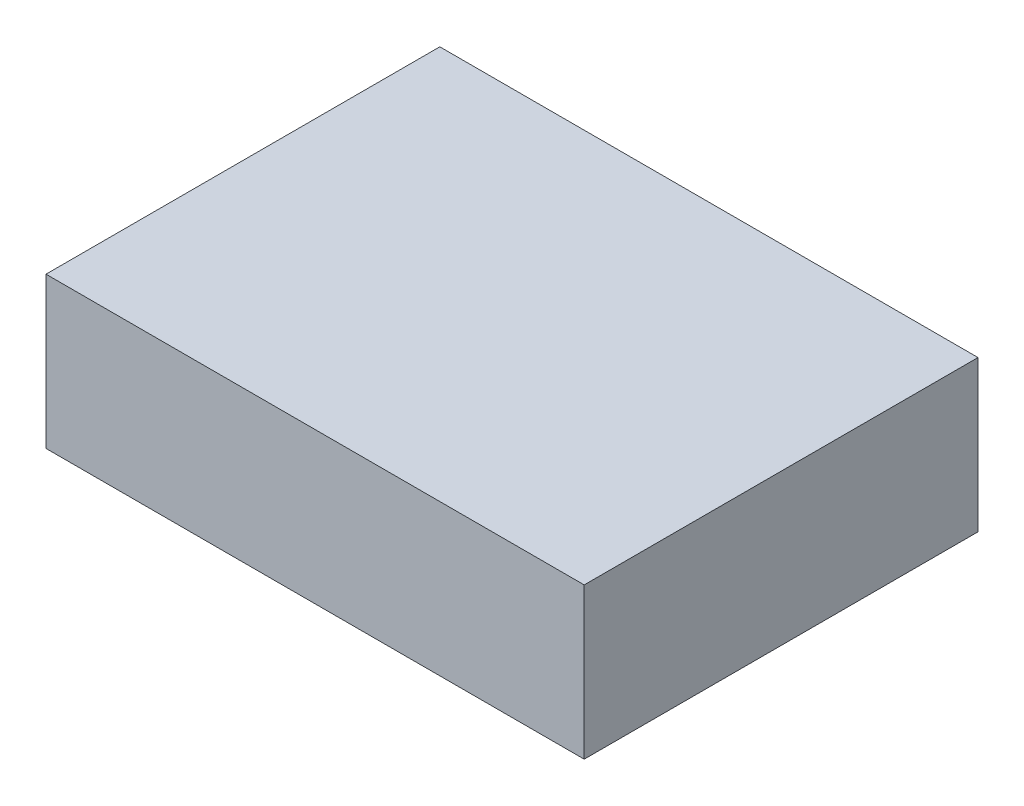
ISO-10303-21;
HEADER;
FILE_DESCRIPTION(('STEP AP214'),'2;1');
FILE_NAME('part.step','',(''),(''),'','','');
FILE_SCHEMA(('AUTOMOTIVE_DESIGN { 1 0 10303 214 1 1 1 1 }'));
ENDSEC;
DATA;
#1=APPLICATION_CONTEXT('core data for automotive mechanical design processes');
#2=APPLICATION_PROTOCOL_DEFINITION('international standard','automotive_design',2000,#1);
#3=PRODUCT_CONTEXT('',#1,'mechanical');
#4=PRODUCT('Part','Part','',(#3));
#5=PRODUCT_RELATED_PRODUCT_CATEGORY('part','',(#4));
#6=PRODUCT_DEFINITION_FORMATION('','',#4);
#7=PRODUCT_DEFINITION_CONTEXT('part definition',#1,'design');
#8=PRODUCT_DEFINITION('design','',#6,#7);
#9=PRODUCT_DEFINITION_SHAPE('','',#8);
#10=(LENGTH_UNIT() NAMED_UNIT(*) SI_UNIT(.MILLI.,.METRE.));
#11=(NAMED_UNIT(*) PLANE_ANGLE_UNIT() SI_UNIT($,.RADIAN.));
#12=(NAMED_UNIT(*) SI_UNIT($,.STERADIAN.) SOLID_ANGLE_UNIT());
#13=UNCERTAINTY_MEASURE_WITH_UNIT(LENGTH_MEASURE(1.E-05),#10,'distance_accuracy_value','');
#14=(GEOMETRIC_REPRESENTATION_CONTEXT(3) GLOBAL_UNCERTAINTY_ASSIGNED_CONTEXT((#13)) GLOBAL_UNIT_ASSIGNED_CONTEXT((#10,
#11,#12)) REPRESENTATION_CONTEXT('',''));
#15=CARTESIAN_POINT('',(0.,0.,0.));
#16=DIRECTION('',(0.,0.,1.));
#17=DIRECTION('',(1.,0.,0.));
#18=AXIS2_PLACEMENT_3D('',#15,#16,#17);
#19=CARTESIAN_POINT('',(2.05,0.64,-2.29));
#20=DIRECTION('',(0.,1.,0.));
#21=DIRECTION('',(0.,0.,1.));
#22=AXIS2_PLACEMENT_3D('',#19,#20,#21);
#23=CYLINDRICAL_SURFACE('',#22,0.15);
#24=CARTESIAN_POINT('',(2.05,0.64,-2.29));
#25=DIRECTION('',(0.,1.,0.));
#26=DIRECTION('',(0.,0.,1.));
#27=AXIS2_PLACEMENT_3D('',#24,#25,#26);
#28=CIRCLE('',#27,0.15);
#29=CARTESIAN_POINT('',(2.05,0.64,-2.14));
#30=VERTEX_POINT('',#29);
#31=EDGE_CURVE('E11',#30,#30,#28,.T.);
#32=ORIENTED_EDGE('',*,*,#31,.T.);
#33=EDGE_LOOP('',(#32));
#34=FACE_BOUND('',#33,.T.);
#35=CARTESIAN_POINT('',(2.05,0.74,-2.29));
#36=DIRECTION('',(0.,1.,0.));
#37=DIRECTION('',(0.,0.,1.));
#38=AXIS2_PLACEMENT_3D('',#35,#36,#37);
#39=CIRCLE('',#38,0.15);
#40=CARTESIAN_POINT('',(2.05,0.74,-2.14));
#41=VERTEX_POINT('',#40);
#42=EDGE_CURVE('E44',#41,#41,#39,.T.);
#43=ORIENTED_EDGE('',*,*,#42,.F.);
#44=EDGE_LOOP('',(#43));
#45=FACE_BOUND('',#44,.T.);
#46=ADVANCED_FACE('F41',(#34,#45),#23,.T.);
#47=CARTESIAN_POINT('',(2.05,0.64,-2.29));
#48=DIRECTION('',(0.,1.,0.));
#49=DIRECTION('',(0.,0.,1.));
#50=AXIS2_PLACEMENT_3D('',#47,#48,#49);
#51=PLANE('',#50);
#52=ORIENTED_EDGE('',*,*,#31,.F.);
#53=EDGE_LOOP('',(#52));
#54=FACE_BOUND('',#53,.T.);
#55=ADVANCED_FACE('F56',(#54),#51,.F.);
#56=CARTESIAN_POINT('',(2.05,0.74,-2.29));
#57=DIRECTION('',(0.,1.,0.));
#58=DIRECTION('',(0.,0.,1.));
#59=AXIS2_PLACEMENT_3D('',#56,#57,#58);
#60=PLANE('',#59);
#61=ORIENTED_EDGE('',*,*,#42,.T.);
#62=EDGE_LOOP('',(#61));
#63=FACE_BOUND('',#62,.T.);
#64=ADVANCED_FACE('F53',(#63),#60,.T.);
#65=CLOSED_SHELL('',(#46,#55,#64));
#66=MANIFOLD_SOLID_BREP('B2',#65);
#67=CARTESIAN_POINT('',(0.,1.15,0.));
#68=DIRECTION('',(1.,0.,0.));
#69=DIRECTION('',(0.,0.,-1.));
#70=AXIS2_PLACEMENT_3D('',#67,#68,#69);
#71=PLANE('',#70);
#72=DIRECTION('',(0.,0.,1.));
#73=VECTOR('',#72,1.);
#74=CARTESIAN_POINT('',(0.,0.,0.));
#75=LINE('',#74,#73);
#76=CARTESIAN_POINT('',(0.,0.,-3.));
#77=VERTEX_POINT('',#76);
#78=CARTESIAN_POINT('',(0.,0.,0.));
#79=VERTEX_POINT('',#78);
#80=EDGE_CURVE('E144',#77,#79,#75,.T.);
#81=ORIENTED_EDGE('',*,*,#80,.T.);
#82=DIRECTION('',(0.,-1.,0.));
#83=VECTOR('',#82,1.);
#84=CARTESIAN_POINT('',(0.,1.15,0.));
#85=LINE('',#84,#83);
#86=CARTESIAN_POINT('',(0.,1.15,0.));
#87=VERTEX_POINT('',#86);
#88=EDGE_CURVE('E39',#87,#79,#85,.T.);
#89=ORIENTED_EDGE('',*,*,#88,.F.);
#90=DIRECTION('',(0.,0.,1.));
#91=VECTOR('',#90,1.);
#92=CARTESIAN_POINT('',(0.,1.15,0.));
#93=LINE('',#92,#91);
#94=CARTESIAN_POINT('',(0.,1.15,-3.));
#95=VERTEX_POINT('',#94);
#96=EDGE_CURVE('E132',#95,#87,#93,.T.);
#97=ORIENTED_EDGE('',*,*,#96,.F.);
#98=DIRECTION('',(0.,-1.,0.));
#99=VECTOR('',#98,1.);
#100=CARTESIAN_POINT('',(0.,1.15,-3.));
#101=LINE('',#100,#99);
#102=EDGE_CURVE('E140',#95,#77,#101,.T.);
#103=ORIENTED_EDGE('',*,*,#102,.T.);
#104=EDGE_LOOP('',(#81,#89,#97,#103));
#105=FACE_BOUND('',#104,.T.);
#106=ADVANCED_FACE('F81',(#105),#71,.F.);
#107=CARTESIAN_POINT('',(0.,1.15,0.));
#108=DIRECTION('',(0.,0.,-1.));
#109=DIRECTION('',(-1.,0.,0.));
#110=AXIS2_PLACEMENT_3D('',#107,#108,#109);
#111=PLANE('',#110);
#112=DIRECTION('',(1.,0.,0.));
#113=VECTOR('',#112,1.);
#114=CARTESIAN_POINT('',(0.,0.,0.));
#115=LINE('',#114,#113);
#116=CARTESIAN_POINT('',(4.1,0.,0.));
#117=VERTEX_POINT('',#116);
#118=EDGE_CURVE('E136',#79,#117,#115,.T.);
#119=ORIENTED_EDGE('',*,*,#118,.T.);
#120=DIRECTION('',(0.,-1.,0.));
#121=VECTOR('',#120,1.);
#122=CARTESIAN_POINT('',(4.1,1.15,0.));
#123=LINE('',#122,#121);
#124=CARTESIAN_POINT('',(4.1,1.15,0.));
#125=VERTEX_POINT('',#124);
#126=EDGE_CURVE('E89',#125,#117,#123,.T.);
#127=ORIENTED_EDGE('',*,*,#126,.F.);
#128=DIRECTION('',(1.,0.,0.));
#129=VECTOR('',#128,1.);
#130=CARTESIAN_POINT('',(0.,1.15,0.));
#131=LINE('',#130,#129);
#132=EDGE_CURVE('E127',#87,#125,#131,.T.);
#133=ORIENTED_EDGE('',*,*,#132,.F.);
#134=ORIENTED_EDGE('',*,*,#88,.T.);
#135=EDGE_LOOP('',(#119,#127,#133,#134));
#136=FACE_BOUND('',#135,.T.);
#137=ADVANCED_FACE('F135',(#136),#111,.F.);
#138=CARTESIAN_POINT('',(4.1,1.15,0.));
#139=DIRECTION('',(-1.,0.,0.));
#140=DIRECTION('',(0.,0.,1.));
#141=AXIS2_PLACEMENT_3D('',#138,#139,#140);
#142=PLANE('',#141);
#143=DIRECTION('',(0.,0.,-1.));
#144=VECTOR('',#143,1.);
#145=CARTESIAN_POINT('',(4.1,0.,0.));
#146=LINE('',#145,#144);
#147=CARTESIAN_POINT('',(4.1,0.,-3.));
#148=VERTEX_POINT('',#147);
#149=EDGE_CURVE('E114',#117,#148,#146,.T.);
#150=ORIENTED_EDGE('',*,*,#149,.T.);
#151=DIRECTION('',(0.,-1.,0.));
#152=VECTOR('',#151,1.);
#153=CARTESIAN_POINT('',(4.1,1.15,-3.));
#154=LINE('',#153,#152);
#155=CARTESIAN_POINT('',(4.1,1.15,-3.));
#156=VERTEX_POINT('',#155);
#157=EDGE_CURVE('E137',#156,#148,#154,.T.);
#158=ORIENTED_EDGE('',*,*,#157,.F.);
#159=DIRECTION('',(0.,0.,-1.));
#160=VECTOR('',#159,1.);
#161=CARTESIAN_POINT('',(4.1,1.15,0.));
#162=LINE('',#161,#160);
#163=EDGE_CURVE('E130',#125,#156,#162,.T.);
#164=ORIENTED_EDGE('',*,*,#163,.F.);
#165=ORIENTED_EDGE('',*,*,#126,.T.);
#166=EDGE_LOOP('',(#150,#158,#164,#165));
#167=FACE_BOUND('',#166,.T.);
#168=ADVANCED_FACE('F138',(#167),#142,.F.);
#169=CARTESIAN_POINT('',(0.,1.15,-3.));
#170=DIRECTION('',(0.,0.,1.));
#171=DIRECTION('',(1.,0.,0.));
#172=AXIS2_PLACEMENT_3D('',#169,#170,#171);
#173=PLANE('',#172);
#174=DIRECTION('',(-1.,0.,0.));
#175=VECTOR('',#174,1.);
#176=CARTESIAN_POINT('',(0.,0.,-3.));
#177=LINE('',#176,#175);
#178=EDGE_CURVE('E120',#148,#77,#177,.T.);
#179=ORIENTED_EDGE('',*,*,#178,.T.);
#180=ORIENTED_EDGE('',*,*,#102,.F.);
#181=DIRECTION('',(-1.,0.,0.));
#182=VECTOR('',#181,1.);
#183=CARTESIAN_POINT('',(0.,1.15,-3.));
#184=LINE('',#183,#182);
#185=EDGE_CURVE('E97',#156,#95,#184,.T.);
#186=ORIENTED_EDGE('',*,*,#185,.F.);
#187=ORIENTED_EDGE('',*,*,#157,.T.);
#188=EDGE_LOOP('',(#179,#180,#186,#187));
#189=FACE_BOUND('',#188,.T.);
#190=ADVANCED_FACE('F151',(#189),#173,.F.);
#191=CARTESIAN_POINT('',(0.,1.15,0.));
#192=DIRECTION('',(0.,-1.,0.));
#193=DIRECTION('',(0.,0.,-1.));
#194=AXIS2_PLACEMENT_3D('',#191,#192,#193);
#195=PLANE('',#194);
#196=ORIENTED_EDGE('',*,*,#96,.T.);
#197=ORIENTED_EDGE('',*,*,#132,.T.);
#198=ORIENTED_EDGE('',*,*,#163,.T.);
#199=ORIENTED_EDGE('',*,*,#185,.T.);
#200=EDGE_LOOP('',(#196,#197,#198,#199));
#201=FACE_BOUND('',#200,.T.);
#202=ADVANCED_FACE('F128',(#201),#195,.F.);
#203=CARTESIAN_POINT('',(0.,0.,0.));
#204=DIRECTION('',(0.,-1.,0.));
#205=DIRECTION('',(0.,0.,-1.));
#206=AXIS2_PLACEMENT_3D('',#203,#204,#205);
#207=PLANE('',#206);
#208=ORIENTED_EDGE('',*,*,#80,.F.);
#209=ORIENTED_EDGE('',*,*,#178,.F.);
#210=ORIENTED_EDGE('',*,*,#149,.F.);
#211=ORIENTED_EDGE('',*,*,#118,.F.);
#212=EDGE_LOOP('',(#208,#209,#210,#211));
#213=FACE_BOUND('',#212,.T.);
#214=ADVANCED_FACE('F154',(#213),#207,.T.);
#215=CLOSED_SHELL('',(#106,#137,#168,#190,#202,#214));
#216=MANIFOLD_SOLID_BREP('B6',#215);
#217=ADVANCED_BREP_SHAPE_REPRESENTATION('',(#18,#66,#216),#14);
#218=SHAPE_DEFINITION_REPRESENTATION(#9,#217);
ENDSEC;
END-ISO-10303-21;
